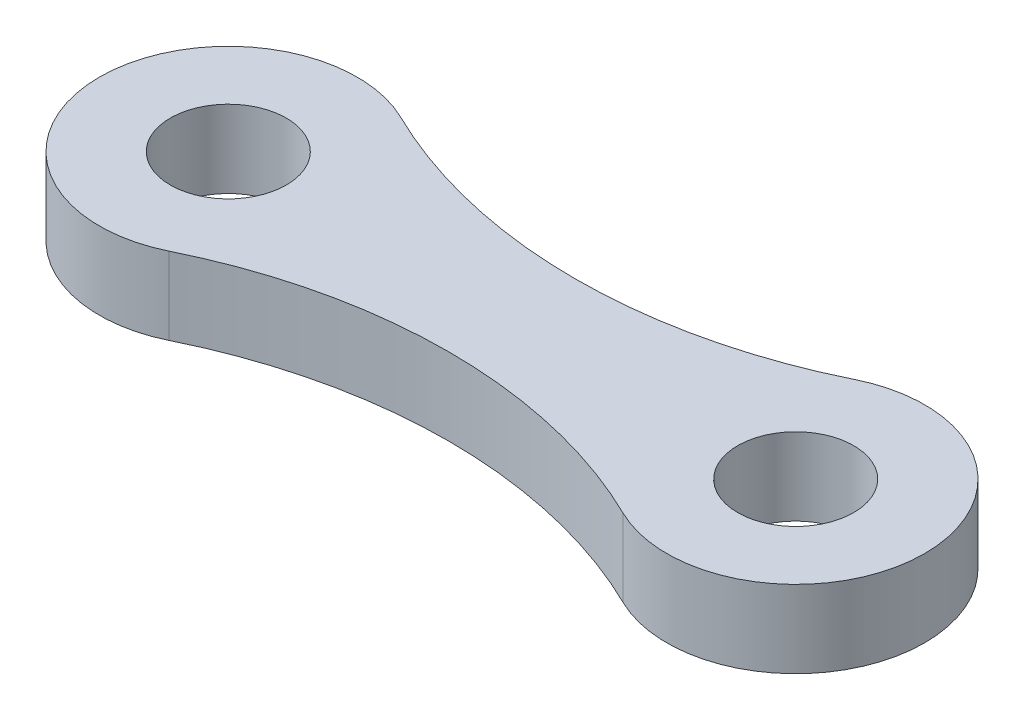
ISO-10303-21;
HEADER;
FILE_DESCRIPTION(('STEP AP214'),'2;1');
FILE_NAME('part.step','',(''),(''),'','','');
FILE_SCHEMA(('AUTOMOTIVE_DESIGN { 1 0 10303 214 1 1 1 1 }'));
ENDSEC;
DATA;
#1=APPLICATION_CONTEXT('core data for automotive mechanical design processes');
#2=APPLICATION_PROTOCOL_DEFINITION('international standard','automotive_design',2000,#1);
#3=PRODUCT_CONTEXT('',#1,'mechanical');
#4=PRODUCT('Part','Part','',(#3));
#5=PRODUCT_RELATED_PRODUCT_CATEGORY('part','',(#4));
#6=PRODUCT_DEFINITION_FORMATION('','',#4);
#7=PRODUCT_DEFINITION_CONTEXT('part definition',#1,'design');
#8=PRODUCT_DEFINITION('design','',#6,#7);
#9=PRODUCT_DEFINITION_SHAPE('','',#8);
#10=(LENGTH_UNIT() NAMED_UNIT(*) SI_UNIT(.MILLI.,.METRE.));
#11=(NAMED_UNIT(*) PLANE_ANGLE_UNIT() SI_UNIT($,.RADIAN.));
#12=(NAMED_UNIT(*) SI_UNIT($,.STERADIAN.) SOLID_ANGLE_UNIT());
#13=UNCERTAINTY_MEASURE_WITH_UNIT(LENGTH_MEASURE(1.E-05),#10,'distance_accuracy_value','');
#14=(GEOMETRIC_REPRESENTATION_CONTEXT(3) GLOBAL_UNCERTAINTY_ASSIGNED_CONTEXT((#13)) GLOBAL_UNIT_ASSIGNED_CONTEXT((#10,
#11,#12)) REPRESENTATION_CONTEXT('',''));
#15=CARTESIAN_POINT('',(0.,0.,0.));
#16=DIRECTION('',(0.,0.,1.));
#17=DIRECTION('',(1.,0.,0.));
#18=AXIS2_PLACEMENT_3D('',#15,#16,#17);
#19=CARTESIAN_POINT('',(2.75,1.5,-5.61248608016091));
#20=DIRECTION('',(0.,1.,0.));
#21=DIRECTION('',(0.,0.,1.));
#22=AXIS2_PLACEMENT_3D('',#19,#20,#21);
#23=PLANE('',#22);
#24=CARTESIAN_POINT('',(-5.5,1.5,0.));
#25=DIRECTION('',(0.,1.,0.));
#26=DIRECTION('',(0.,0.,1.));
#27=AXIS2_PLACEMENT_3D('',#24,#25,#26);
#28=CIRCLE('',#27,1.125);
#29=CARTESIAN_POINT('',(-5.5,1.5,1.125));
#30=VERTEX_POINT('',#29);
#31=EDGE_CURVE('E106',#30,#30,#28,.T.);
#32=ORIENTED_EDGE('',*,*,#31,.F.);
#33=EDGE_LOOP('',(#32));
#34=FACE_BOUND('',#33,.T.);
#35=CARTESIAN_POINT('',(0.,1.5,-11.2249721603218));
#36=DIRECTION('',(0.,-1.,0.));
#37=DIRECTION('',(0.,0.,1.));
#38=AXIS2_PLACEMENT_3D('',#35,#36,#37);
#39=CIRCLE('',#38,10.);
#40=CARTESIAN_POINT('',(4.4,1.5,-2.24499443206437));
#41=VERTEX_POINT('',#40);
#42=CARTESIAN_POINT('',(-4.4,1.5,-2.24499443206437));
#43=VERTEX_POINT('',#42);
#44=EDGE_CURVE('E91',#41,#43,#39,.T.);
#45=ORIENTED_EDGE('',*,*,#44,.T.);
#46=CARTESIAN_POINT('',(-5.5,1.5,0.));
#47=DIRECTION('',(0.,1.,0.));
#48=DIRECTION('',(0.,0.,1.));
#49=AXIS2_PLACEMENT_3D('',#46,#47,#48);
#50=CIRCLE('',#49,2.5);
#51=CARTESIAN_POINT('',(-4.4,1.5,2.24499443206437));
#52=VERTEX_POINT('',#51);
#53=EDGE_CURVE('E86',#43,#52,#50,.T.);
#54=ORIENTED_EDGE('',*,*,#53,.T.);
#55=CARTESIAN_POINT('',(0.,1.5,11.2249721603218));
#56=DIRECTION('',(0.,-1.,0.));
#57=DIRECTION('',(0.,0.,-1.));
#58=AXIS2_PLACEMENT_3D('',#55,#56,#57);
#59=CIRCLE('',#58,10.);
#60=CARTESIAN_POINT('',(4.4,1.5,2.24499443206437));
#61=VERTEX_POINT('',#60);
#62=EDGE_CURVE('E89',#52,#61,#59,.T.);
#63=ORIENTED_EDGE('',*,*,#62,.T.);
#64=CARTESIAN_POINT('',(5.5,1.5,0.));
#65=DIRECTION('',(0.,1.,0.));
#66=DIRECTION('',(0.,0.,1.));
#67=AXIS2_PLACEMENT_3D('',#64,#65,#66);
#68=CIRCLE('',#67,2.5);
#69=EDGE_CURVE('E56',#61,#41,#68,.T.);
#70=ORIENTED_EDGE('',*,*,#69,.T.);
#71=EDGE_LOOP('',(#45,#54,#63,#70));
#72=FACE_BOUND('',#71,.T.);
#73=CARTESIAN_POINT('',(5.5,1.5,0.));
#74=DIRECTION('',(0.,1.,0.));
#75=DIRECTION('',(0.,0.,1.));
#76=AXIS2_PLACEMENT_3D('',#73,#74,#75);
#77=CIRCLE('',#76,1.125);
#78=CARTESIAN_POINT('',(5.5,1.5,1.125));
#79=VERTEX_POINT('',#78);
#80=EDGE_CURVE('E121',#79,#79,#77,.T.);
#81=ORIENTED_EDGE('',*,*,#80,.F.);
#82=EDGE_LOOP('',(#81));
#83=FACE_BOUND('',#82,.T.);
#84=ADVANCED_FACE('F39',(#34,#72,#83),#23,.T.);
#85=CARTESIAN_POINT('',(2.75,0.,-5.61248608016091));
#86=DIRECTION('',(0.,1.,0.));
#87=DIRECTION('',(0.,0.,1.));
#88=AXIS2_PLACEMENT_3D('',#85,#86,#87);
#89=PLANE('',#88);
#90=CARTESIAN_POINT('',(0.,0.,-11.2249721603218));
#91=DIRECTION('',(0.,-1.,0.));
#92=DIRECTION('',(0.,0.,1.));
#93=AXIS2_PLACEMENT_3D('',#90,#91,#92);
#94=CIRCLE('',#93,10.);
#95=CARTESIAN_POINT('',(4.4,0.,-2.24499443206437));
#96=VERTEX_POINT('',#95);
#97=CARTESIAN_POINT('',(-4.4,0.,-2.24499443206437));
#98=VERTEX_POINT('',#97);
#99=EDGE_CURVE('E103',#96,#98,#94,.T.);
#100=ORIENTED_EDGE('',*,*,#99,.F.);
#101=CARTESIAN_POINT('',(5.5,0.,0.));
#102=DIRECTION('',(0.,1.,0.));
#103=DIRECTION('',(0.,0.,1.));
#104=AXIS2_PLACEMENT_3D('',#101,#102,#103);
#105=CIRCLE('',#104,2.5);
#106=CARTESIAN_POINT('',(4.4,0.,2.24499443206437));
#107=VERTEX_POINT('',#106);
#108=EDGE_CURVE('E79',#107,#96,#105,.T.);
#109=ORIENTED_EDGE('',*,*,#108,.F.);
#110=CARTESIAN_POINT('',(0.,0.,11.2249721603218));
#111=DIRECTION('',(0.,-1.,0.));
#112=DIRECTION('',(0.,0.,-1.));
#113=AXIS2_PLACEMENT_3D('',#110,#111,#112);
#114=CIRCLE('',#113,10.);
#115=CARTESIAN_POINT('',(-4.4,0.,2.24499443206437));
#116=VERTEX_POINT('',#115);
#117=EDGE_CURVE('E73',#116,#107,#114,.T.);
#118=ORIENTED_EDGE('',*,*,#117,.F.);
#119=CARTESIAN_POINT('',(-5.5,0.,0.));
#120=DIRECTION('',(0.,1.,0.));
#121=DIRECTION('',(0.,0.,1.));
#122=AXIS2_PLACEMENT_3D('',#119,#120,#121);
#123=CIRCLE('',#122,2.5);
#124=EDGE_CURVE('E95',#98,#116,#123,.T.);
#125=ORIENTED_EDGE('',*,*,#124,.F.);
#126=EDGE_LOOP('',(#100,#109,#118,#125));
#127=FACE_BOUND('',#126,.T.);
#128=CARTESIAN_POINT('',(-5.5,0.,0.));
#129=DIRECTION('',(0.,1.,0.));
#130=DIRECTION('',(0.,0.,1.));
#131=AXIS2_PLACEMENT_3D('',#128,#129,#130);
#132=CIRCLE('',#131,1.125);
#133=CARTESIAN_POINT('',(-5.5,0.,1.125));
#134=VERTEX_POINT('',#133);
#135=EDGE_CURVE('E118',#134,#134,#132,.T.);
#136=ORIENTED_EDGE('',*,*,#135,.T.);
#137=EDGE_LOOP('',(#136));
#138=FACE_BOUND('',#137,.T.);
#139=CARTESIAN_POINT('',(5.5,0.,0.));
#140=DIRECTION('',(0.,1.,0.));
#141=DIRECTION('',(0.,0.,1.));
#142=AXIS2_PLACEMENT_3D('',#139,#140,#141);
#143=CIRCLE('',#142,1.125);
#144=CARTESIAN_POINT('',(5.5,0.,1.125));
#145=VERTEX_POINT('',#144);
#146=EDGE_CURVE('E124',#145,#145,#143,.T.);
#147=ORIENTED_EDGE('',*,*,#146,.T.);
#148=EDGE_LOOP('',(#147));
#149=FACE_BOUND('',#148,.T.);
#150=ADVANCED_FACE('F114',(#127,#138,#149),#89,.F.);
#151=CARTESIAN_POINT('',(0.,1.5,-11.2249721603218));
#152=DIRECTION('',(0.,-1.,0.));
#153=DIRECTION('',(0.,0.,-1.));
#154=AXIS2_PLACEMENT_3D('',#151,#152,#153);
#155=CYLINDRICAL_SURFACE('',#154,10.);
#156=ORIENTED_EDGE('',*,*,#99,.T.);
#157=DIRECTION('',(0.,-1.,0.));
#158=VECTOR('',#157,1.);
#159=CARTESIAN_POINT('',(-4.4,1.5,-2.24499443206437));
#160=LINE('',#159,#158);
#161=EDGE_CURVE('E11',#43,#98,#160,.T.);
#162=ORIENTED_EDGE('',*,*,#161,.F.);
#163=ORIENTED_EDGE('',*,*,#44,.F.);
#164=DIRECTION('',(0.,-1.,0.));
#165=VECTOR('',#164,1.);
#166=CARTESIAN_POINT('',(4.4,1.5,-2.24499443206437));
#167=LINE('',#166,#165);
#168=EDGE_CURVE('E99',#41,#96,#167,.T.);
#169=ORIENTED_EDGE('',*,*,#168,.T.);
#170=EDGE_LOOP('',(#156,#162,#163,#169));
#171=FACE_BOUND('',#170,.T.);
#172=ADVANCED_FACE('F41',(#171),#155,.F.);
#173=CARTESIAN_POINT('',(-5.5,1.5,0.));
#174=DIRECTION('',(0.,-1.,0.));
#175=DIRECTION('',(0.,0.,-1.));
#176=AXIS2_PLACEMENT_3D('',#173,#174,#175);
#177=CYLINDRICAL_SURFACE('',#176,2.5);
#178=ORIENTED_EDGE('',*,*,#124,.T.);
#179=DIRECTION('',(0.,-1.,0.));
#180=VECTOR('',#179,1.);
#181=CARTESIAN_POINT('',(-4.4,1.5,2.24499443206437));
#182=LINE('',#181,#180);
#183=EDGE_CURVE('E48',#52,#116,#182,.T.);
#184=ORIENTED_EDGE('',*,*,#183,.F.);
#185=ORIENTED_EDGE('',*,*,#53,.F.);
#186=ORIENTED_EDGE('',*,*,#161,.T.);
#187=EDGE_LOOP('',(#178,#184,#185,#186));
#188=FACE_BOUND('',#187,.T.);
#189=ADVANCED_FACE('F94',(#188),#177,.T.);
#190=CARTESIAN_POINT('',(0.,1.5,11.2249721603218));
#191=DIRECTION('',(0.,-1.,0.));
#192=DIRECTION('',(0.,0.,-1.));
#193=AXIS2_PLACEMENT_3D('',#190,#191,#192);
#194=CYLINDRICAL_SURFACE('',#193,10.);
#195=ORIENTED_EDGE('',*,*,#117,.T.);
#196=DIRECTION('',(0.,-1.,0.));
#197=VECTOR('',#196,1.);
#198=CARTESIAN_POINT('',(4.4,1.5,2.24499443206437));
#199=LINE('',#198,#197);
#200=EDGE_CURVE('E96',#61,#107,#199,.T.);
#201=ORIENTED_EDGE('',*,*,#200,.F.);
#202=ORIENTED_EDGE('',*,*,#62,.F.);
#203=ORIENTED_EDGE('',*,*,#183,.T.);
#204=EDGE_LOOP('',(#195,#201,#202,#203));
#205=FACE_BOUND('',#204,.T.);
#206=ADVANCED_FACE('F97',(#205),#194,.F.);
#207=CARTESIAN_POINT('',(5.5,1.5,0.));
#208=DIRECTION('',(0.,-1.,0.));
#209=DIRECTION('',(0.,0.,-1.));
#210=AXIS2_PLACEMENT_3D('',#207,#208,#209);
#211=CYLINDRICAL_SURFACE('',#210,2.5);
#212=ORIENTED_EDGE('',*,*,#108,.T.);
#213=ORIENTED_EDGE('',*,*,#168,.F.);
#214=ORIENTED_EDGE('',*,*,#69,.F.);
#215=ORIENTED_EDGE('',*,*,#200,.T.);
#216=EDGE_LOOP('',(#212,#213,#214,#215));
#217=FACE_BOUND('',#216,.T.);
#218=ADVANCED_FACE('F111',(#217),#211,.T.);
#219=CARTESIAN_POINT('',(-5.5,1.5,0.));
#220=DIRECTION('',(0.,-1.,0.));
#221=DIRECTION('',(0.,0.,-1.));
#222=AXIS2_PLACEMENT_3D('',#219,#220,#221);
#223=CYLINDRICAL_SURFACE('',#222,1.125);
#224=ORIENTED_EDGE('',*,*,#31,.T.);
#225=EDGE_LOOP('',(#224));
#226=FACE_BOUND('',#225,.T.);
#227=ORIENTED_EDGE('',*,*,#135,.F.);
#228=EDGE_LOOP('',(#227));
#229=FACE_BOUND('',#228,.T.);
#230=ADVANCED_FACE('F141',(#226,#229),#223,.F.);
#231=CARTESIAN_POINT('',(5.5,1.5,0.));
#232=DIRECTION('',(0.,-1.,0.));
#233=DIRECTION('',(0.,0.,-1.));
#234=AXIS2_PLACEMENT_3D('',#231,#232,#233);
#235=CYLINDRICAL_SURFACE('',#234,1.125);
#236=ORIENTED_EDGE('',*,*,#80,.T.);
#237=EDGE_LOOP('',(#236));
#238=FACE_BOUND('',#237,.T.);
#239=ORIENTED_EDGE('',*,*,#146,.F.);
#240=EDGE_LOOP('',(#239));
#241=FACE_BOUND('',#240,.T.);
#242=ADVANCED_FACE('F130',(#238,#241),#235,.F.);
#243=CLOSED_SHELL('',(#84,#150,#172,#189,#206,#218,#230,#242));
#244=MANIFOLD_SOLID_BREP('B2',#243);
#245=ADVANCED_BREP_SHAPE_REPRESENTATION('',(#18,#244),#14);
#246=SHAPE_DEFINITION_REPRESENTATION(#9,#245);
ENDSEC;
END-ISO-10303-21;
